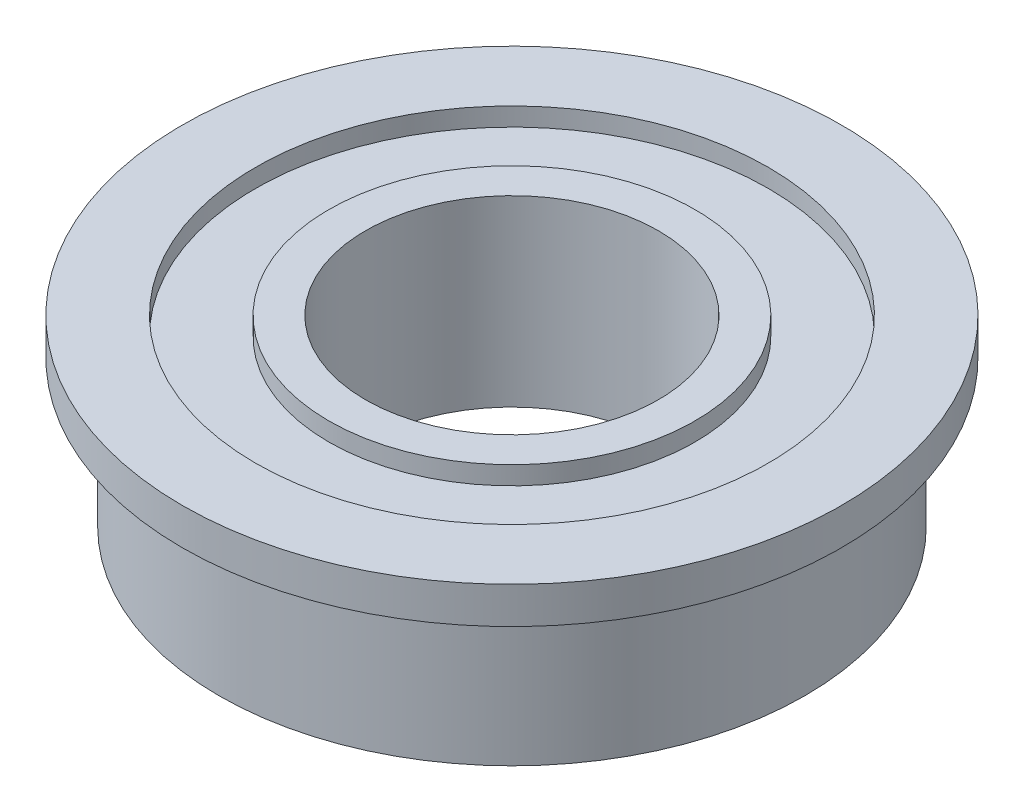
ISO-10303-21;
HEADER;
FILE_DESCRIPTION(('STEP AP214'),'2;1');
FILE_NAME('part.step','',(''),(''),'','','');
FILE_SCHEMA(('AUTOMOTIVE_DESIGN { 1 0 10303 214 1 1 1 1 }'));
ENDSEC;
DATA;
#1=APPLICATION_CONTEXT('core data for automotive mechanical design processes');
#2=APPLICATION_PROTOCOL_DEFINITION('international standard','automotive_design',2000,#1);
#3=PRODUCT_CONTEXT('',#1,'mechanical');
#4=PRODUCT('Part','Part','',(#3));
#5=PRODUCT_RELATED_PRODUCT_CATEGORY('part','',(#4));
#6=PRODUCT_DEFINITION_FORMATION('','',#4);
#7=PRODUCT_DEFINITION_CONTEXT('part definition',#1,'design');
#8=PRODUCT_DEFINITION('design','',#6,#7);
#9=PRODUCT_DEFINITION_SHAPE('','',#8);
#10=(LENGTH_UNIT() NAMED_UNIT(*) SI_UNIT(.MILLI.,.METRE.));
#11=(NAMED_UNIT(*) PLANE_ANGLE_UNIT() SI_UNIT($,.RADIAN.));
#12=(NAMED_UNIT(*) SI_UNIT($,.STERADIAN.) SOLID_ANGLE_UNIT());
#13=UNCERTAINTY_MEASURE_WITH_UNIT(LENGTH_MEASURE(1.E-05),#10,'distance_accuracy_value','');
#14=(GEOMETRIC_REPRESENTATION_CONTEXT(3) GLOBAL_UNCERTAINTY_ASSIGNED_CONTEXT((#13)) GLOBAL_UNIT_ASSIGNED_CONTEXT((#10,
#11,#12)) REPRESENTATION_CONTEXT('',''));
#15=CARTESIAN_POINT('',(0.,0.,0.));
#16=DIRECTION('',(0.,0.,1.));
#17=DIRECTION('',(1.,0.,0.));
#18=AXIS2_PLACEMENT_3D('',#15,#16,#17);
#19=CARTESIAN_POINT('',(0.,5.,0.));
#20=DIRECTION('',(0.,1.,0.));
#21=DIRECTION('',(0.,0.,1.));
#22=AXIS2_PLACEMENT_3D('',#19,#20,#21);
#23=PLANE('',#22);
#24=CARTESIAN_POINT('',(0.,5.,0.));
#25=DIRECTION('',(0.,1.,0.));
#26=DIRECTION('',(0.,0.,1.));
#27=AXIS2_PLACEMENT_3D('',#24,#25,#26);
#28=CIRCLE('',#27,4.);
#29=CARTESIAN_POINT('',(0.,5.,4.));
#30=VERTEX_POINT('',#29);
#31=EDGE_CURVE('E60',#30,#30,#28,.T.);
#32=ORIENTED_EDGE('',*,*,#31,.F.);
#33=EDGE_LOOP('',(#32));
#34=FACE_BOUND('',#33,.T.);
#35=CARTESIAN_POINT('',(0.,5.,0.));
#36=DIRECTION('',(0.,1.,0.));
#37=DIRECTION('',(0.,0.,1.));
#38=AXIS2_PLACEMENT_3D('',#35,#36,#37);
#39=CIRCLE('',#38,5.);
#40=CARTESIAN_POINT('',(0.,5.,5.));
#41=VERTEX_POINT('',#40);
#42=EDGE_CURVE('E92',#41,#41,#39,.T.);
#43=ORIENTED_EDGE('',*,*,#42,.T.);
#44=EDGE_LOOP('',(#43));
#45=FACE_BOUND('',#44,.T.);
#46=ADVANCED_FACE('F37',(#34,#45),#23,.T.);
#47=CARTESIAN_POINT('',(0.,0.,0.));
#48=DIRECTION('',(0.,1.,0.));
#49=DIRECTION('',(0.,0.,1.));
#50=AXIS2_PLACEMENT_3D('',#47,#48,#49);
#51=PLANE('',#50);
#52=CARTESIAN_POINT('',(0.,0.,0.));
#53=DIRECTION('',(0.,1.,0.));
#54=DIRECTION('',(0.,0.,1.));
#55=AXIS2_PLACEMENT_3D('',#52,#53,#54);
#56=CIRCLE('',#55,4.);
#57=CARTESIAN_POINT('',(0.,0.,4.));
#58=VERTEX_POINT('',#57);
#59=EDGE_CURVE('E50',#58,#58,#56,.T.);
#60=ORIENTED_EDGE('',*,*,#59,.T.);
#61=EDGE_LOOP('',(#60));
#62=FACE_BOUND('',#61,.T.);
#63=CARTESIAN_POINT('',(0.,0.,0.));
#64=DIRECTION('',(0.,-1.,0.));
#65=DIRECTION('',(0.,0.,-1.));
#66=AXIS2_PLACEMENT_3D('',#63,#64,#65);
#67=CIRCLE('',#66,5.);
#68=CARTESIAN_POINT('',(0.,0.,-5.));
#69=VERTEX_POINT('',#68);
#70=EDGE_CURVE('E76',#69,#69,#67,.T.);
#71=ORIENTED_EDGE('',*,*,#70,.T.);
#72=EDGE_LOOP('',(#71));
#73=FACE_BOUND('',#72,.T.);
#74=ADVANCED_FACE('F136',(#62,#73),#51,.F.);
#75=CARTESIAN_POINT('',(0.,0.,0.));
#76=DIRECTION('',(0.,-1.,0.));
#77=DIRECTION('',(0.,0.,-1.));
#78=AXIS2_PLACEMENT_3D('',#75,#76,#77);
#79=CIRCLE('',#78,7.);
#80=CARTESIAN_POINT('',(0.,0.,-7.));
#81=VERTEX_POINT('',#80);
#82=EDGE_CURVE('E68',#81,#81,#79,.T.);
#83=ORIENTED_EDGE('',*,*,#82,.F.);
#84=EDGE_LOOP('',(#83));
#85=FACE_BOUND('',#84,.T.);
#86=CARTESIAN_POINT('',(0.,0.,0.));
#87=DIRECTION('',(0.,1.,0.));
#88=DIRECTION('',(0.,0.,1.));
#89=AXIS2_PLACEMENT_3D('',#86,#87,#88);
#90=CIRCLE('',#89,8.);
#91=CARTESIAN_POINT('',(0.,0.,8.));
#92=VERTEX_POINT('',#91);
#93=EDGE_CURVE('E41',#92,#92,#90,.T.);
#94=ORIENTED_EDGE('',*,*,#93,.F.);
#95=EDGE_LOOP('',(#94));
#96=FACE_BOUND('',#95,.T.);
#97=ADVANCED_FACE('F141',(#85,#96),#51,.F.);
#98=CARTESIAN_POINT('',(0.,4.,0.));
#99=DIRECTION('',(0.,-1.,0.));
#100=DIRECTION('',(0.,0.,-1.));
#101=AXIS2_PLACEMENT_3D('',#98,#99,#100);
#102=CYLINDRICAL_SURFACE('',#101,8.);
#103=CARTESIAN_POINT('',(0.,4.,0.));
#104=DIRECTION('',(0.,1.,0.));
#105=DIRECTION('',(0.,0.,1.));
#106=AXIS2_PLACEMENT_3D('',#103,#104,#105);
#107=CIRCLE('',#106,8.);
#108=CARTESIAN_POINT('',(0.,4.,8.));
#109=VERTEX_POINT('',#108);
#110=EDGE_CURVE('E10',#109,#109,#107,.T.);
#111=ORIENTED_EDGE('',*,*,#110,.F.);
#112=EDGE_LOOP('',(#111));
#113=FACE_BOUND('',#112,.T.);
#114=ORIENTED_EDGE('',*,*,#93,.T.);
#115=EDGE_LOOP('',(#114));
#116=FACE_BOUND('',#115,.T.);
#117=ADVANCED_FACE('F39',(#113,#116),#102,.T.);
#118=CARTESIAN_POINT('',(0.,4.,0.));
#119=DIRECTION('',(0.,-1.,0.));
#120=DIRECTION('',(0.,0.,-1.));
#121=AXIS2_PLACEMENT_3D('',#118,#119,#120);
#122=CYLINDRICAL_SURFACE('',#121,4.);
#123=ORIENTED_EDGE('',*,*,#59,.F.);
#124=EDGE_LOOP('',(#123));
#125=FACE_BOUND('',#124,.T.);
#126=ORIENTED_EDGE('',*,*,#31,.T.);
#127=EDGE_LOOP('',(#126));
#128=FACE_BOUND('',#127,.T.);
#129=ADVANCED_FACE('F120',(#125,#128),#122,.F.);
#130=CARTESIAN_POINT('',(0.,5.,0.));
#131=DIRECTION('',(0.,1.,0.));
#132=DIRECTION('',(0.,0.,1.));
#133=AXIS2_PLACEMENT_3D('',#130,#131,#132);
#134=CIRCLE('',#133,7.);
#135=CARTESIAN_POINT('',(0.,5.,7.));
#136=VERTEX_POINT('',#135);
#137=EDGE_CURVE('E84',#136,#136,#134,.T.);
#138=ORIENTED_EDGE('',*,*,#137,.F.);
#139=EDGE_LOOP('',(#138));
#140=FACE_BOUND('',#139,.T.);
#141=CARTESIAN_POINT('',(0.,5.,0.));
#142=DIRECTION('',(0.,1.,0.));
#143=DIRECTION('',(0.,0.,1.));
#144=AXIS2_PLACEMENT_3D('',#141,#142,#143);
#145=CIRCLE('',#144,9.);
#146=CARTESIAN_POINT('',(0.,5.,9.));
#147=VERTEX_POINT('',#146);
#148=EDGE_CURVE('E55',#147,#147,#145,.T.);
#149=ORIENTED_EDGE('',*,*,#148,.T.);
#150=EDGE_LOOP('',(#149));
#151=FACE_BOUND('',#150,.T.);
#152=ADVANCED_FACE('F116',(#140,#151),#23,.T.);
#153=CARTESIAN_POINT('',(0.,4.,0.));
#154=DIRECTION('',(0.,1.,0.));
#155=DIRECTION('',(0.,0.,1.));
#156=AXIS2_PLACEMENT_3D('',#153,#154,#155);
#157=PLANE('',#156);
#158=ORIENTED_EDGE('',*,*,#110,.T.);
#159=EDGE_LOOP('',(#158));
#160=FACE_BOUND('',#159,.T.);
#161=CARTESIAN_POINT('',(0.,4.,0.));
#162=DIRECTION('',(0.,1.,0.));
#163=DIRECTION('',(0.,0.,1.));
#164=AXIS2_PLACEMENT_3D('',#161,#162,#163);
#165=CIRCLE('',#164,9.);
#166=CARTESIAN_POINT('',(0.,4.,9.));
#167=VERTEX_POINT('',#166);
#168=EDGE_CURVE('E56',#167,#167,#165,.T.);
#169=ORIENTED_EDGE('',*,*,#168,.F.);
#170=EDGE_LOOP('',(#169));
#171=FACE_BOUND('',#170,.T.);
#172=ADVANCED_FACE('F119',(#160,#171),#157,.F.);
#173=CARTESIAN_POINT('',(0.,5.,0.));
#174=DIRECTION('',(0.,-1.,0.));
#175=DIRECTION('',(0.,0.,-1.));
#176=AXIS2_PLACEMENT_3D('',#173,#174,#175);
#177=CYLINDRICAL_SURFACE('',#176,9.);
#178=ORIENTED_EDGE('',*,*,#148,.F.);
#179=EDGE_LOOP('',(#178));
#180=FACE_BOUND('',#179,.T.);
#181=ORIENTED_EDGE('',*,*,#168,.T.);
#182=EDGE_LOOP('',(#181));
#183=FACE_BOUND('',#182,.T.);
#184=ADVANCED_FACE('F124',(#180,#183),#177,.T.);
#185=CARTESIAN_POINT('',(0.,0.5,0.));
#186=DIRECTION('',(0.,-1.,0.));
#187=DIRECTION('',(0.,0.,-1.));
#188=AXIS2_PLACEMENT_3D('',#185,#186,#187);
#189=CYLINDRICAL_SURFACE('',#188,7.);
#190=CARTESIAN_POINT('',(0.,0.5,0.));
#191=DIRECTION('',(0.,-1.,0.));
#192=DIRECTION('',(0.,0.,-1.));
#193=AXIS2_PLACEMENT_3D('',#190,#191,#192);
#194=CIRCLE('',#193,7.);
#195=CARTESIAN_POINT('',(0.,0.5,-7.));
#196=VERTEX_POINT('',#195);
#197=EDGE_CURVE('E67',#196,#196,#194,.T.);
#198=ORIENTED_EDGE('',*,*,#197,.F.);
#199=EDGE_LOOP('',(#198));
#200=FACE_BOUND('',#199,.T.);
#201=ORIENTED_EDGE('',*,*,#82,.T.);
#202=EDGE_LOOP('',(#201));
#203=FACE_BOUND('',#202,.T.);
#204=ADVANCED_FACE('F127',(#200,#203),#189,.F.);
#205=CARTESIAN_POINT('',(0.,0.5,0.));
#206=DIRECTION('',(0.,-1.,0.));
#207=DIRECTION('',(0.,0.,-1.));
#208=AXIS2_PLACEMENT_3D('',#205,#206,#207);
#209=PLANE('',#208);
#210=CARTESIAN_POINT('',(0.,0.5,0.));
#211=DIRECTION('',(0.,-1.,0.));
#212=DIRECTION('',(0.,0.,-1.));
#213=AXIS2_PLACEMENT_3D('',#210,#211,#212);
#214=CIRCLE('',#213,5.);
#215=CARTESIAN_POINT('',(0.,0.5,-5.));
#216=VERTEX_POINT('',#215);
#217=EDGE_CURVE('E72',#216,#216,#214,.T.);
#218=ORIENTED_EDGE('',*,*,#217,.F.);
#219=EDGE_LOOP('',(#218));
#220=FACE_BOUND('',#219,.T.);
#221=ORIENTED_EDGE('',*,*,#197,.T.);
#222=EDGE_LOOP('',(#221));
#223=FACE_BOUND('',#222,.T.);
#224=ADVANCED_FACE('F148',(#220,#223),#209,.T.);
#225=CARTESIAN_POINT('',(0.,0.5,0.));
#226=DIRECTION('',(0.,-1.,0.));
#227=DIRECTION('',(0.,0.,-1.));
#228=AXIS2_PLACEMENT_3D('',#225,#226,#227);
#229=CYLINDRICAL_SURFACE('',#228,5.);
#230=ORIENTED_EDGE('',*,*,#217,.T.);
#231=EDGE_LOOP('',(#230));
#232=FACE_BOUND('',#231,.T.);
#233=ORIENTED_EDGE('',*,*,#70,.F.);
#234=EDGE_LOOP('',(#233));
#235=FACE_BOUND('',#234,.T.);
#236=ADVANCED_FACE('F112',(#232,#235),#229,.T.);
#237=CARTESIAN_POINT('',(0.,4.5,0.));
#238=DIRECTION('',(0.,1.,0.));
#239=DIRECTION('',(0.,0.,1.));
#240=AXIS2_PLACEMENT_3D('',#237,#238,#239);
#241=CYLINDRICAL_SURFACE('',#240,7.);
#242=CARTESIAN_POINT('',(0.,4.5,0.));
#243=DIRECTION('',(0.,1.,0.));
#244=DIRECTION('',(0.,0.,1.));
#245=AXIS2_PLACEMENT_3D('',#242,#243,#244);
#246=CIRCLE('',#245,7.);
#247=CARTESIAN_POINT('',(0.,4.5,7.));
#248=VERTEX_POINT('',#247);
#249=EDGE_CURVE('E80',#248,#248,#246,.T.);
#250=ORIENTED_EDGE('',*,*,#249,.F.);
#251=EDGE_LOOP('',(#250));
#252=FACE_BOUND('',#251,.T.);
#253=ORIENTED_EDGE('',*,*,#137,.T.);
#254=EDGE_LOOP('',(#253));
#255=FACE_BOUND('',#254,.T.);
#256=ADVANCED_FACE('F106',(#252,#255),#241,.F.);
#257=CARTESIAN_POINT('',(0.,4.5,0.));
#258=DIRECTION('',(0.,1.,0.));
#259=DIRECTION('',(0.,0.,1.));
#260=AXIS2_PLACEMENT_3D('',#257,#258,#259);
#261=PLANE('',#260);
#262=CARTESIAN_POINT('',(0.,4.5,0.));
#263=DIRECTION('',(0.,1.,0.));
#264=DIRECTION('',(0.,0.,1.));
#265=AXIS2_PLACEMENT_3D('',#262,#263,#264);
#266=CIRCLE('',#265,5.);
#267=CARTESIAN_POINT('',(0.,4.5,5.));
#268=VERTEX_POINT('',#267);
#269=EDGE_CURVE('E88',#268,#268,#266,.T.);
#270=ORIENTED_EDGE('',*,*,#269,.F.);
#271=EDGE_LOOP('',(#270));
#272=FACE_BOUND('',#271,.T.);
#273=ORIENTED_EDGE('',*,*,#249,.T.);
#274=EDGE_LOOP('',(#273));
#275=FACE_BOUND('',#274,.T.);
#276=ADVANCED_FACE('F103',(#272,#275),#261,.T.);
#277=CARTESIAN_POINT('',(0.,4.5,0.));
#278=DIRECTION('',(0.,1.,0.));
#279=DIRECTION('',(0.,0.,1.));
#280=AXIS2_PLACEMENT_3D('',#277,#278,#279);
#281=CYLINDRICAL_SURFACE('',#280,5.);
#282=ORIENTED_EDGE('',*,*,#269,.T.);
#283=EDGE_LOOP('',(#282));
#284=FACE_BOUND('',#283,.T.);
#285=ORIENTED_EDGE('',*,*,#42,.F.);
#286=EDGE_LOOP('',(#285));
#287=FACE_BOUND('',#286,.T.);
#288=ADVANCED_FACE('F100',(#284,#287),#281,.T.);
#289=CLOSED_SHELL('',(#46,#74,#97,#117,#129,#152,#172,#184,#204,#224,#236,#256,#276,#288));
#290=MANIFOLD_SOLID_BREP('B2',#289);
#291=ADVANCED_BREP_SHAPE_REPRESENTATION('',(#18,#290),#14);
#292=SHAPE_DEFINITION_REPRESENTATION(#9,#291);
ENDSEC;
END-ISO-10303-21;
